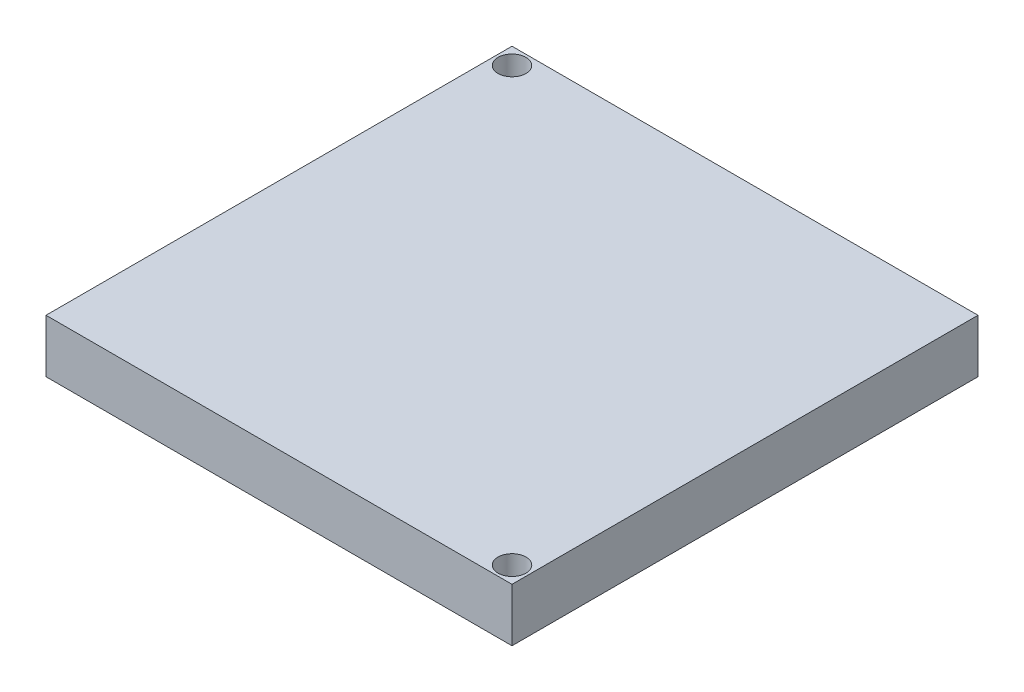
ISO-10303-21;
HEADER;
FILE_DESCRIPTION(('STEP AP214'),'2;1');
FILE_NAME('part.step','',(''),(''),'','','');
FILE_SCHEMA(('AUTOMOTIVE_DESIGN { 1 0 10303 214 1 1 1 1 }'));
ENDSEC;
DATA;
#1=APPLICATION_CONTEXT('core data for automotive mechanical design processes');
#2=APPLICATION_PROTOCOL_DEFINITION('international standard','automotive_design',2000,#1);
#3=PRODUCT_CONTEXT('',#1,'mechanical');
#4=PRODUCT('Part','Part','',(#3));
#5=PRODUCT_RELATED_PRODUCT_CATEGORY('part','',(#4));
#6=PRODUCT_DEFINITION_FORMATION('','',#4);
#7=PRODUCT_DEFINITION_CONTEXT('part definition',#1,'design');
#8=PRODUCT_DEFINITION('design','',#6,#7);
#9=PRODUCT_DEFINITION_SHAPE('','',#8);
#10=(LENGTH_UNIT() NAMED_UNIT(*) SI_UNIT(.MILLI.,.METRE.));
#11=(NAMED_UNIT(*) PLANE_ANGLE_UNIT() SI_UNIT($,.RADIAN.));
#12=(NAMED_UNIT(*) SI_UNIT($,.STERADIAN.) SOLID_ANGLE_UNIT());
#13=UNCERTAINTY_MEASURE_WITH_UNIT(LENGTH_MEASURE(1.E-05),#10,'distance_accuracy_value','');
#14=(GEOMETRIC_REPRESENTATION_CONTEXT(3) GLOBAL_UNCERTAINTY_ASSIGNED_CONTEXT((#13)) GLOBAL_UNIT_ASSIGNED_CONTEXT((#10,
#11,#12)) REPRESENTATION_CONTEXT('',''));
#15=CARTESIAN_POINT('',(0.,0.,0.));
#16=DIRECTION('',(0.,0.,1.));
#17=DIRECTION('',(1.,0.,0.));
#18=AXIS2_PLACEMENT_3D('',#15,#16,#17);
#19=CARTESIAN_POINT('',(35.,8.,-35.));
#20=DIRECTION('',(-1.,0.,0.));
#21=DIRECTION('',(0.,0.,1.));
#22=AXIS2_PLACEMENT_3D('',#19,#20,#21);
#23=PLANE('',#22);
#24=DIRECTION('',(0.,0.,-1.));
#25=VECTOR('',#24,1.);
#26=CARTESIAN_POINT('',(35.,0.,-35.));
#27=LINE('',#26,#25);
#28=CARTESIAN_POINT('',(35.,0.,35.));
#29=VERTEX_POINT('',#28);
#30=CARTESIAN_POINT('',(35.,0.,-35.));
#31=VERTEX_POINT('',#30);
#32=EDGE_CURVE('E97',#29,#31,#27,.T.);
#33=ORIENTED_EDGE('',*,*,#32,.T.);
#34=DIRECTION('',(0.,-1.,0.));
#35=VECTOR('',#34,1.);
#36=CARTESIAN_POINT('',(35.,8.,-35.));
#37=LINE('',#36,#35);
#38=CARTESIAN_POINT('',(35.,8.,-35.));
#39=VERTEX_POINT('',#38);
#40=EDGE_CURVE('E11',#39,#31,#37,.T.);
#41=ORIENTED_EDGE('',*,*,#40,.F.);
#42=DIRECTION('',(0.,0.,-1.));
#43=VECTOR('',#42,1.);
#44=CARTESIAN_POINT('',(35.,8.,-35.));
#45=LINE('',#44,#43);
#46=CARTESIAN_POINT('',(35.,8.,35.));
#47=VERTEX_POINT('',#46);
#48=EDGE_CURVE('E85',#47,#39,#45,.T.);
#49=ORIENTED_EDGE('',*,*,#48,.F.);
#50=DIRECTION('',(0.,-1.,0.));
#51=VECTOR('',#50,1.);
#52=CARTESIAN_POINT('',(35.,8.,35.));
#53=LINE('',#52,#51);
#54=EDGE_CURVE('E93',#47,#29,#53,.T.);
#55=ORIENTED_EDGE('',*,*,#54,.T.);
#56=EDGE_LOOP('',(#33,#41,#49,#55));
#57=FACE_BOUND('',#56,.T.);
#58=ADVANCED_FACE('F34',(#57),#23,.F.);
#59=CARTESIAN_POINT('',(-35.,8.,-35.));
#60=DIRECTION('',(0.,0.,1.));
#61=DIRECTION('',(1.,0.,0.));
#62=AXIS2_PLACEMENT_3D('',#59,#60,#61);
#63=PLANE('',#62);
#64=DIRECTION('',(-1.,0.,0.));
#65=VECTOR('',#64,1.);
#66=CARTESIAN_POINT('',(-35.,0.,-35.));
#67=LINE('',#66,#65);
#68=CARTESIAN_POINT('',(-35.,0.,-35.));
#69=VERTEX_POINT('',#68);
#70=EDGE_CURVE('E89',#31,#69,#67,.T.);
#71=ORIENTED_EDGE('',*,*,#70,.T.);
#72=DIRECTION('',(0.,-1.,0.));
#73=VECTOR('',#72,1.);
#74=CARTESIAN_POINT('',(-35.,8.,-35.));
#75=LINE('',#74,#73);
#76=CARTESIAN_POINT('',(-35.,8.,-35.));
#77=VERTEX_POINT('',#76);
#78=EDGE_CURVE('E42',#77,#69,#75,.T.);
#79=ORIENTED_EDGE('',*,*,#78,.F.);
#80=DIRECTION('',(-1.,0.,0.));
#81=VECTOR('',#80,1.);
#82=CARTESIAN_POINT('',(-35.,8.,-35.));
#83=LINE('',#82,#81);
#84=EDGE_CURVE('E80',#39,#77,#83,.T.);
#85=ORIENTED_EDGE('',*,*,#84,.F.);
#86=ORIENTED_EDGE('',*,*,#40,.T.);
#87=EDGE_LOOP('',(#71,#79,#85,#86));
#88=FACE_BOUND('',#87,.T.);
#89=ADVANCED_FACE('F88',(#88),#63,.F.);
#90=CARTESIAN_POINT('',(-35.,8.,-35.));
#91=DIRECTION('',(1.,0.,0.));
#92=DIRECTION('',(0.,0.,-1.));
#93=AXIS2_PLACEMENT_3D('',#90,#91,#92);
#94=PLANE('',#93);
#95=DIRECTION('',(0.,0.,1.));
#96=VECTOR('',#95,1.);
#97=CARTESIAN_POINT('',(-35.,0.,-35.));
#98=LINE('',#97,#96);
#99=CARTESIAN_POINT('',(-35.,0.,35.));
#100=VERTEX_POINT('',#99);
#101=EDGE_CURVE('E67',#69,#100,#98,.T.);
#102=ORIENTED_EDGE('',*,*,#101,.T.);
#103=DIRECTION('',(0.,-1.,0.));
#104=VECTOR('',#103,1.);
#105=CARTESIAN_POINT('',(-35.,8.,35.));
#106=LINE('',#105,#104);
#107=CARTESIAN_POINT('',(-35.,8.,35.));
#108=VERTEX_POINT('',#107);
#109=EDGE_CURVE('E90',#108,#100,#106,.T.);
#110=ORIENTED_EDGE('',*,*,#109,.F.);
#111=DIRECTION('',(0.,0.,1.));
#112=VECTOR('',#111,1.);
#113=CARTESIAN_POINT('',(-35.,8.,-35.));
#114=LINE('',#113,#112);
#115=EDGE_CURVE('E83',#77,#108,#114,.T.);
#116=ORIENTED_EDGE('',*,*,#115,.F.);
#117=ORIENTED_EDGE('',*,*,#78,.T.);
#118=EDGE_LOOP('',(#102,#110,#116,#117));
#119=FACE_BOUND('',#118,.T.);
#120=ADVANCED_FACE('F91',(#119),#94,.F.);
#121=CARTESIAN_POINT('',(-35.,8.,35.));
#122=DIRECTION('',(0.,0.,-1.));
#123=DIRECTION('',(-1.,0.,0.));
#124=AXIS2_PLACEMENT_3D('',#121,#122,#123);
#125=PLANE('',#124);
#126=DIRECTION('',(1.,0.,0.));
#127=VECTOR('',#126,1.);
#128=CARTESIAN_POINT('',(-35.,0.,35.));
#129=LINE('',#128,#127);
#130=EDGE_CURVE('E73',#100,#29,#129,.T.);
#131=ORIENTED_EDGE('',*,*,#130,.T.);
#132=ORIENTED_EDGE('',*,*,#54,.F.);
#133=DIRECTION('',(1.,0.,0.));
#134=VECTOR('',#133,1.);
#135=CARTESIAN_POINT('',(-35.,8.,35.));
#136=LINE('',#135,#134);
#137=EDGE_CURVE('E50',#108,#47,#136,.T.);
#138=ORIENTED_EDGE('',*,*,#137,.F.);
#139=ORIENTED_EDGE('',*,*,#109,.T.);
#140=EDGE_LOOP('',(#131,#132,#138,#139));
#141=FACE_BOUND('',#140,.T.);
#142=ADVANCED_FACE('F105',(#141),#125,.F.);
#143=CARTESIAN_POINT('',(0.,8.,0.));
#144=DIRECTION('',(0.,1.,0.));
#145=DIRECTION('',(0.,0.,1.));
#146=AXIS2_PLACEMENT_3D('',#143,#144,#145);
#147=PLANE('',#146);
#148=CARTESIAN_POINT('',(32.5,8.,32.5));
#149=DIRECTION('',(0.,1.,0.));
#150=DIRECTION('',(0.,0.,1.));
#151=AXIS2_PLACEMENT_3D('',#148,#149,#150);
#152=CIRCLE('',#151,2.1);
#153=CARTESIAN_POINT('',(32.5,8.,34.6));
#154=VERTEX_POINT('',#153);
#155=EDGE_CURVE('E114',#154,#154,#152,.T.);
#156=ORIENTED_EDGE('',*,*,#155,.F.);
#157=EDGE_LOOP('',(#156));
#158=FACE_BOUND('',#157,.T.);
#159=CARTESIAN_POINT('',(-32.5,8.,-32.5));
#160=DIRECTION('',(0.,1.,0.));
#161=DIRECTION('',(0.,0.,1.));
#162=AXIS2_PLACEMENT_3D('',#159,#160,#161);
#163=CIRCLE('',#162,2.1);
#164=CARTESIAN_POINT('',(-32.5,8.,-30.4));
#165=VERTEX_POINT('',#164);
#166=EDGE_CURVE('E111',#165,#165,#163,.T.);
#167=ORIENTED_EDGE('',*,*,#166,.F.);
#168=EDGE_LOOP('',(#167));
#169=FACE_BOUND('',#168,.T.);
#170=ORIENTED_EDGE('',*,*,#48,.T.);
#171=ORIENTED_EDGE('',*,*,#84,.T.);
#172=ORIENTED_EDGE('',*,*,#115,.T.);
#173=ORIENTED_EDGE('',*,*,#137,.T.);
#174=EDGE_LOOP('',(#170,#171,#172,#173));
#175=FACE_BOUND('',#174,.T.);
#176=ADVANCED_FACE('F81',(#158,#169,#175),#147,.T.);
#177=CARTESIAN_POINT('',(0.,0.,0.));
#178=DIRECTION('',(0.,1.,0.));
#179=DIRECTION('',(0.,0.,1.));
#180=AXIS2_PLACEMENT_3D('',#177,#178,#179);
#181=PLANE('',#180);
#182=CARTESIAN_POINT('',(32.5,0.,32.5));
#183=DIRECTION('',(0.,1.,0.));
#184=DIRECTION('',(0.,0.,1.));
#185=AXIS2_PLACEMENT_3D('',#182,#183,#184);
#186=CIRCLE('',#185,2.1);
#187=CARTESIAN_POINT('',(32.5,0.,34.6));
#188=VERTEX_POINT('',#187);
#189=EDGE_CURVE('E117',#188,#188,#186,.T.);
#190=ORIENTED_EDGE('',*,*,#189,.T.);
#191=EDGE_LOOP('',(#190));
#192=FACE_BOUND('',#191,.T.);
#193=CARTESIAN_POINT('',(-32.5,0.,-32.5));
#194=DIRECTION('',(0.,1.,0.));
#195=DIRECTION('',(0.,0.,1.));
#196=AXIS2_PLACEMENT_3D('',#193,#194,#195);
#197=CIRCLE('',#196,2.1);
#198=CARTESIAN_POINT('',(-32.5,0.,-30.4));
#199=VERTEX_POINT('',#198);
#200=EDGE_CURVE('E100',#199,#199,#197,.T.);
#201=ORIENTED_EDGE('',*,*,#200,.T.);
#202=EDGE_LOOP('',(#201));
#203=FACE_BOUND('',#202,.T.);
#204=ORIENTED_EDGE('',*,*,#32,.F.);
#205=ORIENTED_EDGE('',*,*,#130,.F.);
#206=ORIENTED_EDGE('',*,*,#101,.F.);
#207=ORIENTED_EDGE('',*,*,#70,.F.);
#208=EDGE_LOOP('',(#204,#205,#206,#207));
#209=FACE_BOUND('',#208,.T.);
#210=ADVANCED_FACE('F108',(#192,#203,#209),#181,.F.);
#211=CARTESIAN_POINT('',(-32.5,0.,-32.5));
#212=DIRECTION('',(0.,1.,0.));
#213=DIRECTION('',(0.,0.,1.));
#214=AXIS2_PLACEMENT_3D('',#211,#212,#213);
#215=CYLINDRICAL_SURFACE('',#214,2.1);
#216=ORIENTED_EDGE('',*,*,#200,.F.);
#217=EDGE_LOOP('',(#216));
#218=FACE_BOUND('',#217,.T.);
#219=ORIENTED_EDGE('',*,*,#166,.T.);
#220=EDGE_LOOP('',(#219));
#221=FACE_BOUND('',#220,.T.);
#222=ADVANCED_FACE('F130',(#218,#221),#215,.F.);
#223=CARTESIAN_POINT('',(32.5,0.,32.5));
#224=DIRECTION('',(0.,1.,0.));
#225=DIRECTION('',(0.,0.,1.));
#226=AXIS2_PLACEMENT_3D('',#223,#224,#225);
#227=CYLINDRICAL_SURFACE('',#226,2.1);
#228=ORIENTED_EDGE('',*,*,#189,.F.);
#229=EDGE_LOOP('',(#228));
#230=FACE_BOUND('',#229,.T.);
#231=ORIENTED_EDGE('',*,*,#155,.T.);
#232=EDGE_LOOP('',(#231));
#233=FACE_BOUND('',#232,.T.);
#234=ADVANCED_FACE('F123',(#230,#233),#227,.F.);
#235=CLOSED_SHELL('',(#58,#89,#120,#142,#176,#210,#222,#234));
#236=MANIFOLD_SOLID_BREP('B2',#235);
#237=ADVANCED_BREP_SHAPE_REPRESENTATION('',(#18,#236),#14);
#238=SHAPE_DEFINITION_REPRESENTATION(#9,#237);
ENDSEC;
END-ISO-10303-21;
